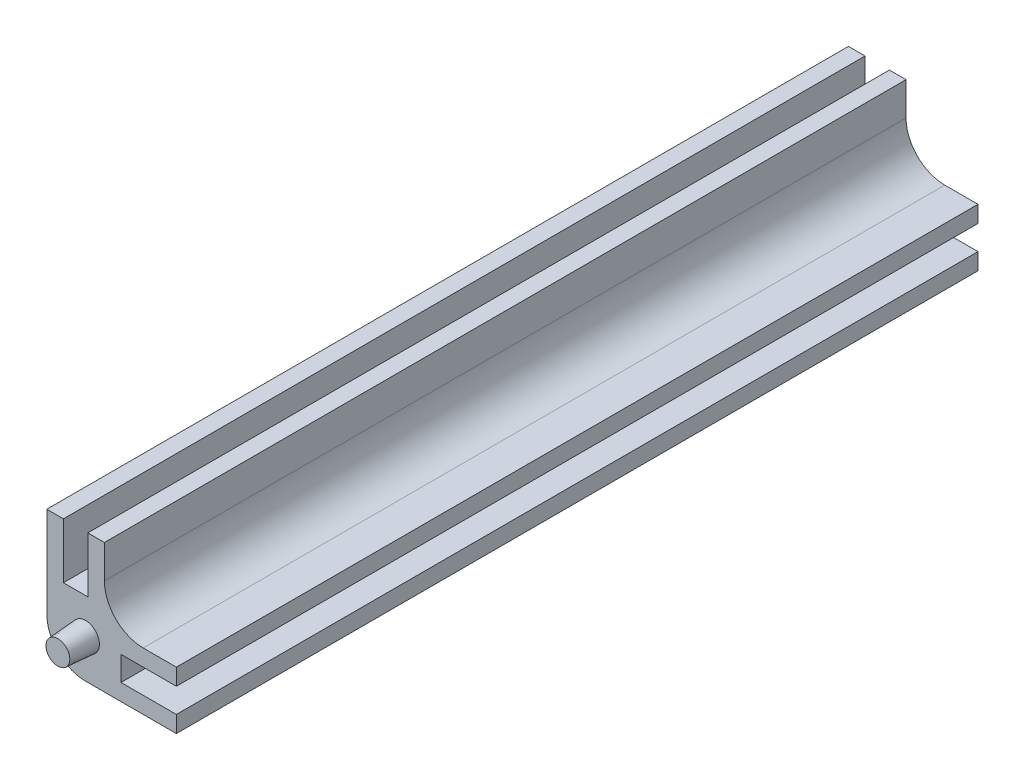
ISO-10303-21;
HEADER;
FILE_DESCRIPTION(('STEP AP214'),'2;1');
FILE_NAME('part.step','',(''),(''),'','','');
FILE_SCHEMA(('AUTOMOTIVE_DESIGN { 1 0 10303 214 1 1 1 1 }'));
ENDSEC;
DATA;
#1=APPLICATION_CONTEXT('core data for automotive mechanical design processes');
#2=APPLICATION_PROTOCOL_DEFINITION('international standard','automotive_design',2000,#1);
#3=PRODUCT_CONTEXT('',#1,'mechanical');
#4=PRODUCT('Part','Part','',(#3));
#5=PRODUCT_RELATED_PRODUCT_CATEGORY('part','',(#4));
#6=PRODUCT_DEFINITION_FORMATION('','',#4);
#7=PRODUCT_DEFINITION_CONTEXT('part definition',#1,'design');
#8=PRODUCT_DEFINITION('design','',#6,#7);
#9=PRODUCT_DEFINITION_SHAPE('','',#8);
#10=(LENGTH_UNIT() NAMED_UNIT(*) SI_UNIT(.MILLI.,.METRE.));
#11=(NAMED_UNIT(*) PLANE_ANGLE_UNIT() SI_UNIT($,.RADIAN.));
#12=(NAMED_UNIT(*) SI_UNIT($,.STERADIAN.) SOLID_ANGLE_UNIT());
#13=UNCERTAINTY_MEASURE_WITH_UNIT(LENGTH_MEASURE(1.E-05),#10,'distance_accuracy_value','');
#14=(GEOMETRIC_REPRESENTATION_CONTEXT(3) GLOBAL_UNCERTAINTY_ASSIGNED_CONTEXT((#13)) GLOBAL_UNIT_ASSIGNED_CONTEXT((#10,
#11,#12)) REPRESENTATION_CONTEXT('',''));
#15=CARTESIAN_POINT('',(0.,0.,0.));
#16=DIRECTION('',(0.,0.,1.));
#17=DIRECTION('',(1.,0.,0.));
#18=AXIS2_PLACEMENT_3D('',#15,#16,#17);
#19=CARTESIAN_POINT('',(13.,-10.4,144.8));
#20=DIRECTION('',(-1.,0.,0.));
#21=DIRECTION('',(0.,0.,1.));
#22=AXIS2_PLACEMENT_3D('',#19,#20,#21);
#23=PLANE('',#22);
#24=DIRECTION('',(0.,1.,0.));
#25=VECTOR('',#24,1.);
#26=CARTESIAN_POINT('',(13.,-10.4,0.));
#27=LINE('',#26,#25);
#28=CARTESIAN_POINT('',(13.,-10.4,0.));
#29=VERTEX_POINT('',#28);
#30=CARTESIAN_POINT('',(13.,-7.4,0.));
#31=VERTEX_POINT('',#30);
#32=EDGE_CURVE('E176',#29,#31,#27,.T.);
#33=ORIENTED_EDGE('',*,*,#32,.T.);
#34=DIRECTION('',(0.,0.,-1.));
#35=VECTOR('',#34,1.);
#36=CARTESIAN_POINT('',(13.,-7.4,144.8));
#37=LINE('',#36,#35);
#38=CARTESIAN_POINT('',(13.,-7.4,144.8));
#39=VERTEX_POINT('',#38);
#40=EDGE_CURVE('E11',#39,#31,#37,.T.);
#41=ORIENTED_EDGE('',*,*,#40,.F.);
#42=DIRECTION('',(0.,1.,0.));
#43=VECTOR('',#42,1.);
#44=CARTESIAN_POINT('',(13.,-10.4,144.8));
#45=LINE('',#44,#43);
#46=CARTESIAN_POINT('',(13.,-10.4,144.8));
#47=VERTEX_POINT('',#46);
#48=EDGE_CURVE('E207',#47,#39,#45,.T.);
#49=ORIENTED_EDGE('',*,*,#48,.F.);
#50=DIRECTION('',(0.,0.,-1.));
#51=VECTOR('',#50,1.);
#52=CARTESIAN_POINT('',(13.,-10.4,144.8));
#53=LINE('',#52,#51);
#54=EDGE_CURVE('E172',#47,#29,#53,.T.);
#55=ORIENTED_EDGE('',*,*,#54,.T.);
#56=EDGE_LOOP('',(#33,#41,#49,#55));
#57=FACE_BOUND('',#56,.T.);
#58=ADVANCED_FACE('F32',(#57),#23,.F.);
#59=CARTESIAN_POINT('',(13.,-7.4,144.8));
#60=DIRECTION('',(0.,-1.,0.));
#61=DIRECTION('',(1.,0.,0.));
#62=AXIS2_PLACEMENT_3D('',#59,#60,#61);
#63=PLANE('',#62);
#64=DIRECTION('',(-1.,0.,0.));
#65=VECTOR('',#64,1.);
#66=CARTESIAN_POINT('',(13.,-7.4,0.));
#67=LINE('',#66,#65);
#68=CARTESIAN_POINT('',(3.,-7.4,0.));
#69=VERTEX_POINT('',#68);
#70=EDGE_CURVE('E179',#31,#69,#67,.T.);
#71=ORIENTED_EDGE('',*,*,#70,.T.);
#72=DIRECTION('',(0.,0.,-1.));
#73=VECTOR('',#72,1.);
#74=CARTESIAN_POINT('',(3.,-7.4,144.8));
#75=LINE('',#74,#73);
#76=CARTESIAN_POINT('',(3.,-7.4,144.8));
#77=VERTEX_POINT('',#76);
#78=EDGE_CURVE('E40',#77,#69,#75,.T.);
#79=ORIENTED_EDGE('',*,*,#78,.F.);
#80=DIRECTION('',(-1.,0.,0.));
#81=VECTOR('',#80,1.);
#82=CARTESIAN_POINT('',(13.,-7.4,144.8));
#83=LINE('',#82,#81);
#84=EDGE_CURVE('E115',#39,#77,#83,.T.);
#85=ORIENTED_EDGE('',*,*,#84,.F.);
#86=ORIENTED_EDGE('',*,*,#40,.T.);
#87=EDGE_LOOP('',(#71,#79,#85,#86));
#88=FACE_BOUND('',#87,.T.);
#89=ADVANCED_FACE('F306',(#88),#63,.F.);
#90=CARTESIAN_POINT('',(3.,-7.4,144.8));
#91=DIRECTION('',(-1.,0.,0.));
#92=DIRECTION('',(0.,-1.,0.));
#93=AXIS2_PLACEMENT_3D('',#90,#91,#92);
#94=PLANE('',#93);
#95=DIRECTION('',(0.,1.,0.));
#96=VECTOR('',#95,1.);
#97=CARTESIAN_POINT('',(3.,-7.4,0.));
#98=LINE('',#97,#96);
#99=CARTESIAN_POINT('',(3.,-3.,0.));
#100=VERTEX_POINT('',#99);
#101=EDGE_CURVE('E182',#69,#100,#98,.T.);
#102=ORIENTED_EDGE('',*,*,#101,.T.);
#103=DIRECTION('',(0.,0.,-1.));
#104=VECTOR('',#103,1.);
#105=CARTESIAN_POINT('',(3.,-3.,144.8));
#106=LINE('',#105,#104);
#107=CARTESIAN_POINT('',(3.,-3.,144.8));
#108=VERTEX_POINT('',#107);
#109=EDGE_CURVE('E238',#108,#100,#106,.T.);
#110=ORIENTED_EDGE('',*,*,#109,.F.);
#111=DIRECTION('',(0.,1.,0.));
#112=VECTOR('',#111,1.);
#113=CARTESIAN_POINT('',(3.,-7.4,144.8));
#114=LINE('',#113,#112);
#115=EDGE_CURVE('E246',#77,#108,#114,.T.);
#116=ORIENTED_EDGE('',*,*,#115,.F.);
#117=ORIENTED_EDGE('',*,*,#78,.T.);
#118=EDGE_LOOP('',(#102,#110,#116,#117));
#119=FACE_BOUND('',#118,.T.);
#120=ADVANCED_FACE('F244',(#119),#94,.F.);
#121=CARTESIAN_POINT('',(3.,-3.,144.8));
#122=DIRECTION('',(0.,1.,0.));
#123=DIRECTION('',(0.,0.,1.));
#124=AXIS2_PLACEMENT_3D('',#121,#122,#123);
#125=PLANE('',#124);
#126=DIRECTION('',(1.,0.,0.));
#127=VECTOR('',#126,1.);
#128=CARTESIAN_POINT('',(3.,-3.,0.));
#129=LINE('',#128,#127);
#130=CARTESIAN_POINT('',(13.,-3.,0.));
#131=VERTEX_POINT('',#130);
#132=EDGE_CURVE('E184',#100,#131,#129,.T.);
#133=ORIENTED_EDGE('',*,*,#132,.T.);
#134=DIRECTION('',(0.,0.,-1.));
#135=VECTOR('',#134,1.);
#136=CARTESIAN_POINT('',(13.,-3.,144.8));
#137=LINE('',#136,#135);
#138=CARTESIAN_POINT('',(13.,-3.,144.8));
#139=VERTEX_POINT('',#138);
#140=EDGE_CURVE('E235',#139,#131,#137,.T.);
#141=ORIENTED_EDGE('',*,*,#140,.F.);
#142=DIRECTION('',(1.,0.,0.));
#143=VECTOR('',#142,1.);
#144=CARTESIAN_POINT('',(3.,-3.,144.8));
#145=LINE('',#144,#143);
#146=EDGE_CURVE('E264',#108,#139,#145,.T.);
#147=ORIENTED_EDGE('',*,*,#146,.F.);
#148=ORIENTED_EDGE('',*,*,#109,.T.);
#149=EDGE_LOOP('',(#133,#141,#147,#148));
#150=FACE_BOUND('',#149,.T.);
#151=ADVANCED_FACE('F255',(#150),#125,.F.);
#152=CARTESIAN_POINT('',(13.,-3.,144.8));
#153=DIRECTION('',(-1.,0.,0.));
#154=DIRECTION('',(0.,-1.,0.));
#155=AXIS2_PLACEMENT_3D('',#152,#153,#154);
#156=PLANE('',#155);
#157=DIRECTION('',(0.,1.,0.));
#158=VECTOR('',#157,1.);
#159=CARTESIAN_POINT('',(13.,-3.,0.));
#160=LINE('',#159,#158);
#161=CARTESIAN_POINT('',(13.,0.,0.));
#162=VERTEX_POINT('',#161);
#163=EDGE_CURVE('E186',#131,#162,#160,.T.);
#164=ORIENTED_EDGE('',*,*,#163,.T.);
#165=DIRECTION('',(0.,0.,-1.));
#166=VECTOR('',#165,1.);
#167=CARTESIAN_POINT('',(13.,0.,144.8));
#168=LINE('',#167,#166);
#169=CARTESIAN_POINT('',(13.,0.,144.8));
#170=VERTEX_POINT('',#169);
#171=EDGE_CURVE('E232',#170,#162,#168,.T.);
#172=ORIENTED_EDGE('',*,*,#171,.F.);
#173=DIRECTION('',(0.,1.,0.));
#174=VECTOR('',#173,1.);
#175=CARTESIAN_POINT('',(13.,-3.,144.8));
#176=LINE('',#175,#174);
#177=EDGE_CURVE('E261',#139,#170,#176,.T.);
#178=ORIENTED_EDGE('',*,*,#177,.F.);
#179=ORIENTED_EDGE('',*,*,#140,.T.);
#180=EDGE_LOOP('',(#164,#172,#178,#179));
#181=FACE_BOUND('',#180,.T.);
#182=ADVANCED_FACE('F259',(#181),#156,.F.);
#183=CARTESIAN_POINT('',(13.,0.,144.8));
#184=DIRECTION('',(0.,-1.,0.));
#185=DIRECTION('',(0.,0.,-1.));
#186=AXIS2_PLACEMENT_3D('',#183,#184,#185);
#187=PLANE('',#186);
#188=DIRECTION('',(-1.,0.,0.));
#189=VECTOR('',#188,1.);
#190=CARTESIAN_POINT('',(13.,0.,0.));
#191=LINE('',#190,#189);
#192=CARTESIAN_POINT('',(7.00000000000005,0.,0.));
#193=VERTEX_POINT('',#192);
#194=EDGE_CURVE('E188',#162,#193,#191,.T.);
#195=ORIENTED_EDGE('',*,*,#194,.T.);
#196=DIRECTION('',(0.,0.,-1.));
#197=VECTOR('',#196,1.);
#198=CARTESIAN_POINT('',(7.00000000000005,0.,144.8));
#199=LINE('',#198,#197);
#200=CARTESIAN_POINT('',(7.00000000000005,0.,144.8));
#201=VERTEX_POINT('',#200);
#202=EDGE_CURVE('E229',#201,#193,#199,.T.);
#203=ORIENTED_EDGE('',*,*,#202,.F.);
#204=DIRECTION('',(-1.,0.,0.));
#205=VECTOR('',#204,1.);
#206=CARTESIAN_POINT('',(13.,0.,144.8));
#207=LINE('',#206,#205);
#208=EDGE_CURVE('E263',#170,#201,#207,.T.);
#209=ORIENTED_EDGE('',*,*,#208,.F.);
#210=ORIENTED_EDGE('',*,*,#171,.T.);
#211=EDGE_LOOP('',(#195,#203,#209,#210));
#212=FACE_BOUND('',#211,.T.);
#213=ADVANCED_FACE('F319',(#212),#187,.F.);
#214=CARTESIAN_POINT('',(7.,7.,144.8));
#215=DIRECTION('',(0.,0.,-1.));
#216=DIRECTION('',(-1.,0.,0.));
#217=AXIS2_PLACEMENT_3D('',#214,#215,#216);
#218=CYLINDRICAL_SURFACE('',#217,7.);
#219=CARTESIAN_POINT('',(7.,7.,0.));
#220=DIRECTION('',(0.,0.,-1.));
#221=DIRECTION('',(1.,0.,0.));
#222=AXIS2_PLACEMENT_3D('',#219,#220,#221);
#223=CIRCLE('',#222,7.);
#224=CARTESIAN_POINT('',(0.,7.00000000000005,0.));
#225=VERTEX_POINT('',#224);
#226=EDGE_CURVE('E190',#193,#225,#223,.T.);
#227=ORIENTED_EDGE('',*,*,#226,.T.);
#228=DIRECTION('',(0.,0.,-1.));
#229=VECTOR('',#228,1.);
#230=CARTESIAN_POINT('',(0.,7.00000000000005,144.8));
#231=LINE('',#230,#229);
#232=CARTESIAN_POINT('',(0.,7.00000000000005,144.8));
#233=VERTEX_POINT('',#232);
#234=EDGE_CURVE('E226',#233,#225,#231,.T.);
#235=ORIENTED_EDGE('',*,*,#234,.F.);
#236=CARTESIAN_POINT('',(7.,7.,144.8));
#237=DIRECTION('',(0.,0.,-1.));
#238=DIRECTION('',(1.,0.,0.));
#239=AXIS2_PLACEMENT_3D('',#236,#237,#238);
#240=CIRCLE('',#239,7.);
#241=EDGE_CURVE('E266',#201,#233,#240,.T.);
#242=ORIENTED_EDGE('',*,*,#241,.F.);
#243=ORIENTED_EDGE('',*,*,#202,.T.);
#244=EDGE_LOOP('',(#227,#235,#242,#243));
#245=FACE_BOUND('',#244,.T.);
#246=ADVANCED_FACE('F322',(#245),#218,.F.);
#247=CARTESIAN_POINT('',(0.,7.00000000000005,144.8));
#248=DIRECTION('',(-1.,0.,0.));
#249=DIRECTION('',(0.,-1.,0.));
#250=AXIS2_PLACEMENT_3D('',#247,#248,#249);
#251=PLANE('',#250);
#252=DIRECTION('',(0.,1.,0.));
#253=VECTOR('',#252,1.);
#254=CARTESIAN_POINT('',(0.,7.00000000000005,0.));
#255=LINE('',#254,#253);
#256=CARTESIAN_POINT('',(0.,13.,0.));
#257=VERTEX_POINT('',#256);
#258=EDGE_CURVE('E192',#225,#257,#255,.T.);
#259=ORIENTED_EDGE('',*,*,#258,.T.);
#260=DIRECTION('',(0.,0.,-1.));
#261=VECTOR('',#260,1.);
#262=CARTESIAN_POINT('',(0.,13.,144.8));
#263=LINE('',#262,#261);
#264=CARTESIAN_POINT('',(0.,13.,144.8));
#265=VERTEX_POINT('',#264);
#266=EDGE_CURVE('E223',#265,#257,#263,.T.);
#267=ORIENTED_EDGE('',*,*,#266,.F.);
#268=DIRECTION('',(0.,1.,0.));
#269=VECTOR('',#268,1.);
#270=CARTESIAN_POINT('',(0.,7.00000000000005,144.8));
#271=LINE('',#270,#269);
#272=EDGE_CURVE('E272',#233,#265,#271,.T.);
#273=ORIENTED_EDGE('',*,*,#272,.F.);
#274=ORIENTED_EDGE('',*,*,#234,.T.);
#275=EDGE_LOOP('',(#259,#267,#273,#274));
#276=FACE_BOUND('',#275,.T.);
#277=ADVANCED_FACE('F326',(#276),#251,.F.);
#278=CARTESIAN_POINT('',(0.,13.,144.8));
#279=DIRECTION('',(0.,-1.,0.));
#280=DIRECTION('',(0.,0.,-1.));
#281=AXIS2_PLACEMENT_3D('',#278,#279,#280);
#282=PLANE('',#281);
#283=DIRECTION('',(-1.,0.,0.));
#284=VECTOR('',#283,1.);
#285=CARTESIAN_POINT('',(0.,13.,0.));
#286=LINE('',#285,#284);
#287=CARTESIAN_POINT('',(-3.,13.,0.));
#288=VERTEX_POINT('',#287);
#289=EDGE_CURVE('E194',#257,#288,#286,.T.);
#290=ORIENTED_EDGE('',*,*,#289,.T.);
#291=DIRECTION('',(0.,0.,-1.));
#292=VECTOR('',#291,1.);
#293=CARTESIAN_POINT('',(-3.,13.,144.8));
#294=LINE('',#293,#292);
#295=CARTESIAN_POINT('',(-3.,13.,144.8));
#296=VERTEX_POINT('',#295);
#297=EDGE_CURVE('E220',#296,#288,#294,.T.);
#298=ORIENTED_EDGE('',*,*,#297,.F.);
#299=DIRECTION('',(-1.,0.,0.));
#300=VECTOR('',#299,1.);
#301=CARTESIAN_POINT('',(0.,13.,144.8));
#302=LINE('',#301,#300);
#303=EDGE_CURVE('E274',#265,#296,#302,.T.);
#304=ORIENTED_EDGE('',*,*,#303,.F.);
#305=ORIENTED_EDGE('',*,*,#266,.T.);
#306=EDGE_LOOP('',(#290,#298,#304,#305));
#307=FACE_BOUND('',#306,.T.);
#308=ADVANCED_FACE('F330',(#307),#282,.F.);
#309=CARTESIAN_POINT('',(-3.,13.,144.8));
#310=DIRECTION('',(1.,0.,0.));
#311=DIRECTION('',(0.,0.,-1.));
#312=AXIS2_PLACEMENT_3D('',#309,#310,#311);
#313=PLANE('',#312);
#314=DIRECTION('',(0.,-1.,0.));
#315=VECTOR('',#314,1.);
#316=CARTESIAN_POINT('',(-3.,13.,0.));
#317=LINE('',#316,#315);
#318=CARTESIAN_POINT('',(-3.,3.00000000000001,0.));
#319=VERTEX_POINT('',#318);
#320=EDGE_CURVE('E196',#288,#319,#317,.T.);
#321=ORIENTED_EDGE('',*,*,#320,.T.);
#322=DIRECTION('',(0.,0.,-1.));
#323=VECTOR('',#322,1.);
#324=CARTESIAN_POINT('',(-3.,3.00000000000001,144.8));
#325=LINE('',#324,#323);
#326=CARTESIAN_POINT('',(-3.,3.00000000000001,144.8));
#327=VERTEX_POINT('',#326);
#328=EDGE_CURVE('E217',#327,#319,#325,.T.);
#329=ORIENTED_EDGE('',*,*,#328,.F.);
#330=DIRECTION('',(0.,-1.,0.));
#331=VECTOR('',#330,1.);
#332=CARTESIAN_POINT('',(-3.,13.,144.8));
#333=LINE('',#332,#331);
#334=EDGE_CURVE('E276',#296,#327,#333,.T.);
#335=ORIENTED_EDGE('',*,*,#334,.F.);
#336=ORIENTED_EDGE('',*,*,#297,.T.);
#337=EDGE_LOOP('',(#321,#329,#335,#336));
#338=FACE_BOUND('',#337,.T.);
#339=ADVANCED_FACE('F334',(#338),#313,.F.);
#340=CARTESIAN_POINT('',(-3.,3.00000000000001,144.8));
#341=DIRECTION('',(0.,-1.,0.));
#342=DIRECTION('',(1.,0.,0.));
#343=AXIS2_PLACEMENT_3D('',#340,#341,#342);
#344=PLANE('',#343);
#345=DIRECTION('',(-1.,0.,0.));
#346=VECTOR('',#345,1.);
#347=CARTESIAN_POINT('',(-3.,3.00000000000001,0.));
#348=LINE('',#347,#346);
#349=CARTESIAN_POINT('',(-7.4,3.00000000000001,0.));
#350=VERTEX_POINT('',#349);
#351=EDGE_CURVE('E198',#319,#350,#348,.T.);
#352=ORIENTED_EDGE('',*,*,#351,.T.);
#353=DIRECTION('',(0.,0.,-1.));
#354=VECTOR('',#353,1.);
#355=CARTESIAN_POINT('',(-7.4,3.00000000000001,144.8));
#356=LINE('',#355,#354);
#357=CARTESIAN_POINT('',(-7.4,3.00000000000001,144.8));
#358=VERTEX_POINT('',#357);
#359=EDGE_CURVE('E214',#358,#350,#356,.T.);
#360=ORIENTED_EDGE('',*,*,#359,.F.);
#361=DIRECTION('',(-1.,0.,0.));
#362=VECTOR('',#361,1.);
#363=CARTESIAN_POINT('',(-3.,3.00000000000001,144.8));
#364=LINE('',#363,#362);
#365=EDGE_CURVE('E278',#327,#358,#364,.T.);
#366=ORIENTED_EDGE('',*,*,#365,.F.);
#367=ORIENTED_EDGE('',*,*,#328,.T.);
#368=EDGE_LOOP('',(#352,#360,#366,#367));
#369=FACE_BOUND('',#368,.T.);
#370=ADVANCED_FACE('F338',(#369),#344,.F.);
#371=CARTESIAN_POINT('',(-7.4,3.00000000000001,144.8));
#372=DIRECTION('',(-1.,0.,0.));
#373=DIRECTION('',(0.,0.,1.));
#374=AXIS2_PLACEMENT_3D('',#371,#372,#373);
#375=PLANE('',#374);
#376=DIRECTION('',(0.,1.,0.));
#377=VECTOR('',#376,1.);
#378=CARTESIAN_POINT('',(-7.4,3.00000000000001,0.));
#379=LINE('',#378,#377);
#380=CARTESIAN_POINT('',(-7.4,13.,0.));
#381=VERTEX_POINT('',#380);
#382=EDGE_CURVE('E200',#350,#381,#379,.T.);
#383=ORIENTED_EDGE('',*,*,#382,.T.);
#384=DIRECTION('',(0.,0.,-1.));
#385=VECTOR('',#384,1.);
#386=CARTESIAN_POINT('',(-7.4,13.,144.8));
#387=LINE('',#386,#385);
#388=CARTESIAN_POINT('',(-7.4,13.,144.8));
#389=VERTEX_POINT('',#388);
#390=EDGE_CURVE('E211',#389,#381,#387,.T.);
#391=ORIENTED_EDGE('',*,*,#390,.F.);
#392=DIRECTION('',(0.,1.,0.));
#393=VECTOR('',#392,1.);
#394=CARTESIAN_POINT('',(-7.4,3.00000000000001,144.8));
#395=LINE('',#394,#393);
#396=EDGE_CURVE('E280',#358,#389,#395,.T.);
#397=ORIENTED_EDGE('',*,*,#396,.F.);
#398=ORIENTED_EDGE('',*,*,#359,.T.);
#399=EDGE_LOOP('',(#383,#391,#397,#398));
#400=FACE_BOUND('',#399,.T.);
#401=ADVANCED_FACE('F286',(#400),#375,.F.);
#402=CARTESIAN_POINT('',(-7.4,13.,144.8));
#403=DIRECTION('',(0.,-1.,0.));
#404=DIRECTION('',(0.,0.,-1.));
#405=AXIS2_PLACEMENT_3D('',#402,#403,#404);
#406=PLANE('',#405);
#407=DIRECTION('',(-1.,0.,0.));
#408=VECTOR('',#407,1.);
#409=CARTESIAN_POINT('',(-7.4,13.,0.));
#410=LINE('',#409,#408);
#411=CARTESIAN_POINT('',(-10.4,13.,0.));
#412=VERTEX_POINT('',#411);
#413=EDGE_CURVE('E202',#381,#412,#410,.T.);
#414=ORIENTED_EDGE('',*,*,#413,.T.);
#415=DIRECTION('',(0.,0.,-1.));
#416=VECTOR('',#415,1.);
#417=CARTESIAN_POINT('',(-10.4,13.,144.8));
#418=LINE('',#417,#416);
#419=CARTESIAN_POINT('',(-10.4,13.,144.8));
#420=VERTEX_POINT('',#419);
#421=EDGE_CURVE('E167',#420,#412,#418,.T.);
#422=ORIENTED_EDGE('',*,*,#421,.F.);
#423=DIRECTION('',(-1.,0.,0.));
#424=VECTOR('',#423,1.);
#425=CARTESIAN_POINT('',(-7.4,13.,144.8));
#426=LINE('',#425,#424);
#427=EDGE_CURVE('E158',#389,#420,#426,.T.);
#428=ORIENTED_EDGE('',*,*,#427,.F.);
#429=ORIENTED_EDGE('',*,*,#390,.T.);
#430=EDGE_LOOP('',(#414,#422,#428,#429));
#431=FACE_BOUND('',#430,.T.);
#432=ADVANCED_FACE('F290',(#431),#406,.F.);
#433=CARTESIAN_POINT('',(-10.4,13.,144.8));
#434=DIRECTION('',(1.,0.,0.));
#435=DIRECTION('',(0.,1.,0.));
#436=AXIS2_PLACEMENT_3D('',#433,#434,#435);
#437=PLANE('',#436);
#438=DIRECTION('',(0.,-1.,0.));
#439=VECTOR('',#438,1.);
#440=CARTESIAN_POINT('',(-10.4,13.,0.));
#441=LINE('',#440,#439);
#442=CARTESIAN_POINT('',(-10.4,-3.4,0.));
#443=VERTEX_POINT('',#442);
#444=EDGE_CURVE('E166',#412,#443,#441,.T.);
#445=ORIENTED_EDGE('',*,*,#444,.T.);
#446=DIRECTION('',(0.,0.,-1.));
#447=VECTOR('',#446,1.);
#448=CARTESIAN_POINT('',(-10.4,-3.4,144.8));
#449=LINE('',#448,#447);
#450=CARTESIAN_POINT('',(-10.4,-3.4,144.8));
#451=VERTEX_POINT('',#450);
#452=EDGE_CURVE('E163',#451,#443,#449,.T.);
#453=ORIENTED_EDGE('',*,*,#452,.F.);
#454=DIRECTION('',(0.,-1.,0.));
#455=VECTOR('',#454,1.);
#456=CARTESIAN_POINT('',(-10.4,13.,144.8));
#457=LINE('',#456,#455);
#458=EDGE_CURVE('E152',#420,#451,#457,.T.);
#459=ORIENTED_EDGE('',*,*,#458,.F.);
#460=ORIENTED_EDGE('',*,*,#421,.T.);
#461=EDGE_LOOP('',(#445,#453,#459,#460));
#462=FACE_BOUND('',#461,.T.);
#463=ADVANCED_FACE('F164',(#462),#437,.F.);
#464=CARTESIAN_POINT('',(-3.4,-3.4,144.8));
#465=DIRECTION('',(0.,0.,-1.));
#466=DIRECTION('',(-1.,0.,0.));
#467=AXIS2_PLACEMENT_3D('',#464,#465,#466);
#468=CYLINDRICAL_SURFACE('',#467,7.);
#469=CARTESIAN_POINT('',(-3.4,-3.4,0.));
#470=DIRECTION('',(0.,0.,1.));
#471=DIRECTION('',(1.,0.,0.));
#472=AXIS2_PLACEMENT_3D('',#469,#470,#471);
#473=CIRCLE('',#472,7.);
#474=CARTESIAN_POINT('',(-3.4,-10.4,0.));
#475=VERTEX_POINT('',#474);
#476=EDGE_CURVE('E101',#443,#475,#473,.T.);
#477=ORIENTED_EDGE('',*,*,#476,.T.);
#478=DIRECTION('',(0.,0.,-1.));
#479=VECTOR('',#478,1.);
#480=CARTESIAN_POINT('',(-3.4,-10.4,144.8));
#481=LINE('',#480,#479);
#482=CARTESIAN_POINT('',(-3.4,-10.4,144.8));
#483=VERTEX_POINT('',#482);
#484=EDGE_CURVE('E168',#483,#475,#481,.T.);
#485=ORIENTED_EDGE('',*,*,#484,.F.);
#486=CARTESIAN_POINT('',(-3.4,-3.4,144.8));
#487=DIRECTION('',(0.,0.,1.));
#488=DIRECTION('',(1.,0.,0.));
#489=AXIS2_PLACEMENT_3D('',#486,#487,#488);
#490=CIRCLE('',#489,7.);
#491=EDGE_CURVE('E156',#451,#483,#490,.T.);
#492=ORIENTED_EDGE('',*,*,#491,.F.);
#493=ORIENTED_EDGE('',*,*,#452,.T.);
#494=EDGE_LOOP('',(#477,#485,#492,#493));
#495=FACE_BOUND('',#494,.T.);
#496=ADVANCED_FACE('F170',(#495),#468,.T.);
#497=CARTESIAN_POINT('',(-3.4,-10.4,144.8));
#498=DIRECTION('',(0.,1.,0.));
#499=DIRECTION('',(0.,0.,1.));
#500=AXIS2_PLACEMENT_3D('',#497,#498,#499);
#501=PLANE('',#500);
#502=DIRECTION('',(1.,0.,0.));
#503=VECTOR('',#502,1.);
#504=CARTESIAN_POINT('',(-3.4,-10.4,0.));
#505=LINE('',#504,#503);
#506=EDGE_CURVE('E107',#475,#29,#505,.T.);
#507=ORIENTED_EDGE('',*,*,#506,.T.);
#508=ORIENTED_EDGE('',*,*,#54,.F.);
#509=DIRECTION('',(1.,0.,0.));
#510=VECTOR('',#509,1.);
#511=CARTESIAN_POINT('',(-3.4,-10.4,144.8));
#512=LINE('',#511,#510);
#513=EDGE_CURVE('E48',#483,#47,#512,.T.);
#514=ORIENTED_EDGE('',*,*,#513,.F.);
#515=ORIENTED_EDGE('',*,*,#484,.T.);
#516=EDGE_LOOP('',(#507,#508,#514,#515));
#517=FACE_BOUND('',#516,.T.);
#518=ADVANCED_FACE('F294',(#517),#501,.F.);
#519=CARTESIAN_POINT('',(7.,7.,144.8));
#520=DIRECTION('',(0.,0.,1.));
#521=DIRECTION('',(1.,0.,0.));
#522=AXIS2_PLACEMENT_3D('',#519,#520,#521);
#523=PLANE('',#522);
#524=CARTESIAN_POINT('',(-3.4,-3.4,144.8));
#525=DIRECTION('',(0.,0.,1.));
#526=DIRECTION('',(1.,0.,0.));
#527=AXIS2_PLACEMENT_3D('',#524,#525,#526);
#528=CIRCLE('',#527,2.5);
#529=CARTESIAN_POINT('',(-0.899999999999995,-3.4,144.8));
#530=VERTEX_POINT('',#529);
#531=EDGE_CURVE('E421',#530,#530,#528,.T.);
#532=ORIENTED_EDGE('',*,*,#531,.F.);
#533=EDGE_LOOP('',(#532));
#534=FACE_BOUND('',#533,.T.);
#535=ORIENTED_EDGE('',*,*,#48,.T.);
#536=ORIENTED_EDGE('',*,*,#84,.T.);
#537=ORIENTED_EDGE('',*,*,#115,.T.);
#538=ORIENTED_EDGE('',*,*,#146,.T.);
#539=ORIENTED_EDGE('',*,*,#177,.T.);
#540=ORIENTED_EDGE('',*,*,#208,.T.);
#541=ORIENTED_EDGE('',*,*,#241,.T.);
#542=ORIENTED_EDGE('',*,*,#272,.T.);
#543=ORIENTED_EDGE('',*,*,#303,.T.);
#544=ORIENTED_EDGE('',*,*,#334,.T.);
#545=ORIENTED_EDGE('',*,*,#365,.T.);
#546=ORIENTED_EDGE('',*,*,#396,.T.);
#547=ORIENTED_EDGE('',*,*,#427,.T.);
#548=ORIENTED_EDGE('',*,*,#458,.T.);
#549=ORIENTED_EDGE('',*,*,#491,.T.);
#550=ORIENTED_EDGE('',*,*,#513,.T.);
#551=EDGE_LOOP('',(#535,#536,#537,#538,#539,#540,#541,#542,#543,#544,#545,#546,#547,#548,#549,#550));
#552=FACE_BOUND('',#551,.T.);
#553=ADVANCED_FACE('F154',(#534,#552),#523,.T.);
#554=CARTESIAN_POINT('',(7.,7.,0.));
#555=DIRECTION('',(0.,0.,1.));
#556=DIRECTION('',(1.,0.,0.));
#557=AXIS2_PLACEMENT_3D('',#554,#555,#556);
#558=PLANE('',#557);
#559=CARTESIAN_POINT('',(-3.4,-3.4,0.));
#560=DIRECTION('',(0.,0.,-1.));
#561=DIRECTION('',(-1.,0.,0.));
#562=AXIS2_PLACEMENT_3D('',#559,#560,#561);
#563=CIRCLE('',#562,2.6);
#564=CARTESIAN_POINT('',(-6.,-3.4,0.));
#565=VERTEX_POINT('',#564);
#566=EDGE_CURVE('E422',#565,#565,#563,.T.);
#567=ORIENTED_EDGE('',*,*,#566,.F.);
#568=EDGE_LOOP('',(#567));
#569=FACE_BOUND('',#568,.T.);
#570=ORIENTED_EDGE('',*,*,#32,.F.);
#571=ORIENTED_EDGE('',*,*,#506,.F.);
#572=ORIENTED_EDGE('',*,*,#476,.F.);
#573=ORIENTED_EDGE('',*,*,#444,.F.);
#574=ORIENTED_EDGE('',*,*,#413,.F.);
#575=ORIENTED_EDGE('',*,*,#382,.F.);
#576=ORIENTED_EDGE('',*,*,#351,.F.);
#577=ORIENTED_EDGE('',*,*,#320,.F.);
#578=ORIENTED_EDGE('',*,*,#289,.F.);
#579=ORIENTED_EDGE('',*,*,#258,.F.);
#580=ORIENTED_EDGE('',*,*,#226,.F.);
#581=ORIENTED_EDGE('',*,*,#194,.F.);
#582=ORIENTED_EDGE('',*,*,#163,.F.);
#583=ORIENTED_EDGE('',*,*,#132,.F.);
#584=ORIENTED_EDGE('',*,*,#101,.F.);
#585=ORIENTED_EDGE('',*,*,#70,.F.);
#586=EDGE_LOOP('',(#570,#571,#572,#573,#574,#575,#576,#577,#578,#579,#580,#581,#582,#583,#584,#585));
#587=FACE_BOUND('',#586,.T.);
#588=ADVANCED_FACE('F250',(#569,#587),#558,.F.);
#589=CARTESIAN_POINT('',(-3.4,-3.4,144.8));
#590=DIRECTION('',(0.,0.,-1.));
#591=DIRECTION('',(1.,0.,0.));
#592=AXIS2_PLACEMENT_3D('',#589,#590,#591);
#593=CONICAL_SURFACE('',#592,2.5,0.0698131700797733);
#594=CARTESIAN_POINT('',(-3.4,-3.4,149.8));
#595=DIRECTION('',(0.,0.,1.));
#596=DIRECTION('',(1.,0.,0.));
#597=AXIS2_PLACEMENT_3D('',#594,#595,#596);
#598=CIRCLE('',#597,2.15036594028245);
#599=CARTESIAN_POINT('',(-1.24963405971755,-3.4,149.8));
#600=VERTEX_POINT('',#599);
#601=EDGE_CURVE('E180',#600,#600,#598,.T.);
#602=ORIENTED_EDGE('',*,*,#601,.F.);
#603=EDGE_LOOP('',(#602));
#604=FACE_BOUND('',#603,.T.);
#605=ORIENTED_EDGE('',*,*,#531,.T.);
#606=EDGE_LOOP('',(#605));
#607=FACE_BOUND('',#606,.T.);
#608=ADVANCED_FACE('F373',(#604,#607),#593,.T.);
#609=CARTESIAN_POINT('',(-3.4,-3.4,149.8));
#610=DIRECTION('',(0.,0.,1.));
#611=DIRECTION('',(1.,0.,0.));
#612=AXIS2_PLACEMENT_3D('',#609,#610,#611);
#613=PLANE('',#612);
#614=ORIENTED_EDGE('',*,*,#601,.T.);
#615=EDGE_LOOP('',(#614));
#616=FACE_BOUND('',#615,.T.);
#617=ADVANCED_FACE('F378',(#616),#613,.T.);
#618=CARTESIAN_POINT('',(-3.4,-3.4,0.));
#619=DIRECTION('',(0.,0.,-1.));
#620=DIRECTION('',(-1.,0.,0.));
#621=AXIS2_PLACEMENT_3D('',#618,#619,#620);
#622=CONICAL_SURFACE('',#621,2.6,0.0663225115757847);
#623=CARTESIAN_POINT('',(-3.4,-3.4,5.2));
#624=DIRECTION('',(0.,0.,-1.));
#625=DIRECTION('',(-1.,0.,0.));
#626=AXIS2_PLACEMENT_3D('',#623,#624,#625);
#627=CIRCLE('',#626,2.2546163810824);
#628=CARTESIAN_POINT('',(-5.6546163810824,-3.4,5.2));
#629=VERTEX_POINT('',#628);
#630=EDGE_CURVE('E420',#629,#629,#627,.T.);
#631=ORIENTED_EDGE('',*,*,#630,.F.);
#632=EDGE_LOOP('',(#631));
#633=FACE_BOUND('',#632,.T.);
#634=ORIENTED_EDGE('',*,*,#566,.T.);
#635=EDGE_LOOP('',(#634));
#636=FACE_BOUND('',#635,.T.);
#637=ADVANCED_FACE('F388',(#633,#636),#622,.F.);
#638=CARTESIAN_POINT('',(-3.4,-3.4,5.2));
#639=DIRECTION('',(0.,0.,-1.));
#640=DIRECTION('',(-1.,0.,0.));
#641=AXIS2_PLACEMENT_3D('',#638,#639,#640);
#642=PLANE('',#641);
#643=ORIENTED_EDGE('',*,*,#630,.T.);
#644=EDGE_LOOP('',(#643));
#645=FACE_BOUND('',#644,.T.);
#646=ADVANCED_FACE('F404',(#645),#642,.T.);
#647=CLOSED_SHELL('',(#58,#89,#120,#151,#182,#213,#246,#277,#308,#339,#370,#401,#432,#463,#496,
#518,#553,#588,#608,#617,#637,#646));
#648=MANIFOLD_SOLID_BREP('B2',#647);
#649=ADVANCED_BREP_SHAPE_REPRESENTATION('',(#18,#648),#14);
#650=SHAPE_DEFINITION_REPRESENTATION(#9,#649);
ENDSEC;
END-ISO-10303-21;
